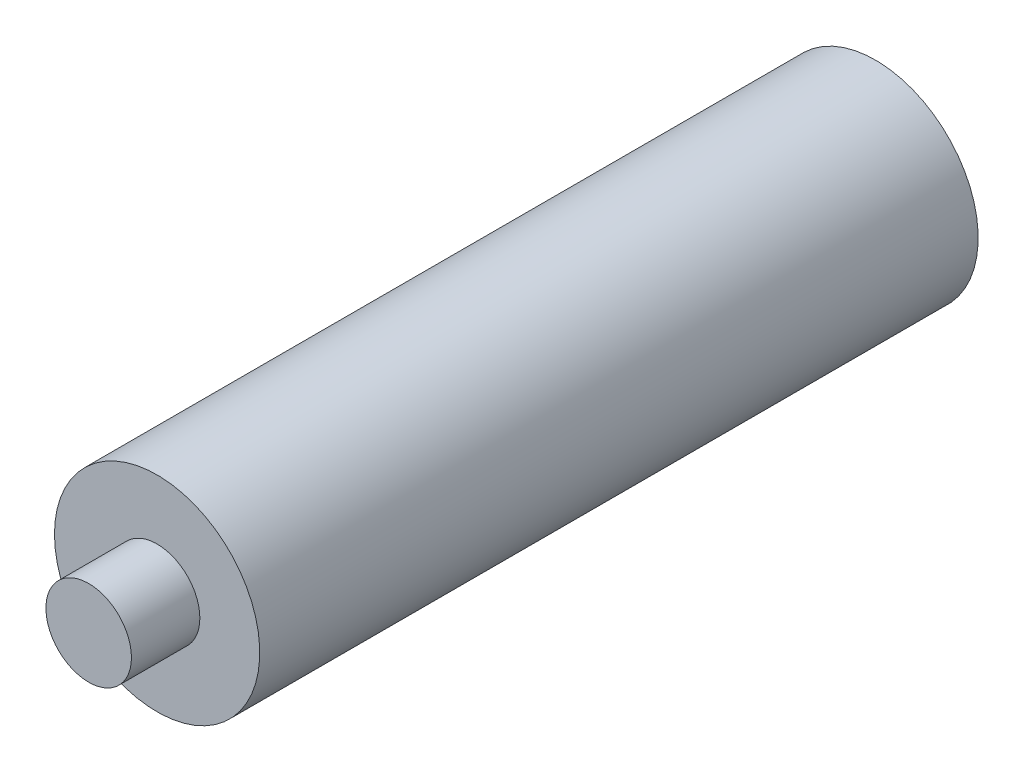
ISO-10303-21;
HEADER;
FILE_DESCRIPTION(('STEP AP214'),'2;1');
FILE_NAME('part.step','',(''),(''),'','','');
FILE_SCHEMA(('AUTOMOTIVE_DESIGN { 1 0 10303 214 1 1 1 1 }'));
ENDSEC;
DATA;
#1=APPLICATION_CONTEXT('core data for automotive mechanical design processes');
#2=APPLICATION_PROTOCOL_DEFINITION('international standard','automotive_design',2000,#1);
#3=PRODUCT_CONTEXT('',#1,'mechanical');
#4=PRODUCT('Part','Part','',(#3));
#5=PRODUCT_RELATED_PRODUCT_CATEGORY('part','',(#4));
#6=PRODUCT_DEFINITION_FORMATION('','',#4);
#7=PRODUCT_DEFINITION_CONTEXT('part definition',#1,'design');
#8=PRODUCT_DEFINITION('design','',#6,#7);
#9=PRODUCT_DEFINITION_SHAPE('','',#8);
#10=(LENGTH_UNIT() NAMED_UNIT(*) SI_UNIT(.MILLI.,.METRE.));
#11=(NAMED_UNIT(*) PLANE_ANGLE_UNIT() SI_UNIT($,.RADIAN.));
#12=(NAMED_UNIT(*) SI_UNIT($,.STERADIAN.) SOLID_ANGLE_UNIT());
#13=UNCERTAINTY_MEASURE_WITH_UNIT(LENGTH_MEASURE(1.E-05),#10,'distance_accuracy_value','');
#14=(GEOMETRIC_REPRESENTATION_CONTEXT(3) GLOBAL_UNCERTAINTY_ASSIGNED_CONTEXT((#13)) GLOBAL_UNIT_ASSIGNED_CONTEXT((#10,
#11,#12)) REPRESENTATION_CONTEXT('',''));
#15=CARTESIAN_POINT('',(0.,0.,0.));
#16=DIRECTION('',(0.,0.,1.));
#17=DIRECTION('',(1.,0.,0.));
#18=AXIS2_PLACEMENT_3D('',#15,#16,#17);
#19=CARTESIAN_POINT('',(0.,0.,21.));
#20=DIRECTION('',(0.,0.,-1.));
#21=DIRECTION('',(-1.,0.,0.));
#22=AXIS2_PLACEMENT_3D('',#19,#20,#21);
#23=CYLINDRICAL_SURFACE('',#22,3.);
#24=CARTESIAN_POINT('',(0.,0.,21.));
#25=DIRECTION('',(0.,0.,1.));
#26=DIRECTION('',(1.,0.,0.));
#27=AXIS2_PLACEMENT_3D('',#24,#25,#26);
#28=CIRCLE('',#27,3.);
#29=CARTESIAN_POINT('',(-3.,0.,21.));
#30=VERTEX_POINT('',#29);
#31=EDGE_CURVE('E41',#30,#30,#28,.T.);
#32=CARTESIAN_POINT('',(0.,0.,0.));
#33=DIRECTION('',(0.,0.,1.));
#34=DIRECTION('',(1.,0.,0.));
#35=AXIS2_PLACEMENT_3D('',#32,#33,#34);
#36=CIRCLE('',#35,3.);
#37=CARTESIAN_POINT('',(-3.,0.,0.));
#38=VERTEX_POINT('',#37);
#39=EDGE_CURVE('E37',#38,#38,#36,.T.);
#40=CARTESIAN_POINT('',(-3.,0.,21.));
#41=CARTESIAN_POINT('',(-3.,0.,20.78125));
#42=CARTESIAN_POINT('',(-3.,0.,20.5625));
#43=CARTESIAN_POINT('',(-3.,0.,20.125));
#44=CARTESIAN_POINT('',(-3.,0.,19.90625));
#45=CARTESIAN_POINT('',(-3.,0.,19.46875));
#46=CARTESIAN_POINT('',(-3.,0.,19.25));
#47=CARTESIAN_POINT('',(-3.,0.,18.8125));
#48=CARTESIAN_POINT('',(-3.,0.,18.59375));
#49=CARTESIAN_POINT('',(-3.,0.,18.15625));
#50=CARTESIAN_POINT('',(-3.,0.,17.9375));
#51=CARTESIAN_POINT('',(-3.,0.,17.5));
#52=CARTESIAN_POINT('',(-3.,0.,17.28125));
#53=CARTESIAN_POINT('',(-3.,0.,16.84375));
#54=CARTESIAN_POINT('',(-3.,0.,16.625));
#55=CARTESIAN_POINT('',(-3.,0.,16.1875));
#56=CARTESIAN_POINT('',(-3.,0.,15.96875));
#57=CARTESIAN_POINT('',(-3.,0.,15.53125));
#58=CARTESIAN_POINT('',(-3.,0.,15.3125));
#59=CARTESIAN_POINT('',(-3.,0.,14.875));
#60=CARTESIAN_POINT('',(-3.,0.,14.65625));
#61=CARTESIAN_POINT('',(-3.,0.,14.21875));
#62=CARTESIAN_POINT('',(-3.,0.,14.));
#63=CARTESIAN_POINT('',(-3.,0.,13.5625));
#64=CARTESIAN_POINT('',(-3.,0.,13.34375));
#65=CARTESIAN_POINT('',(-3.,0.,12.90625));
#66=CARTESIAN_POINT('',(-3.,0.,12.6875));
#67=CARTESIAN_POINT('',(-3.,0.,12.25));
#68=CARTESIAN_POINT('',(-3.,0.,12.03125));
#69=CARTESIAN_POINT('',(-3.,0.,11.59375));
#70=CARTESIAN_POINT('',(-3.,0.,11.375));
#71=CARTESIAN_POINT('',(-3.,0.,10.9375));
#72=CARTESIAN_POINT('',(-3.,0.,10.71875));
#73=CARTESIAN_POINT('',(-3.,0.,10.28125));
#74=CARTESIAN_POINT('',(-3.,0.,10.0625));
#75=CARTESIAN_POINT('',(-3.,0.,9.625));
#76=CARTESIAN_POINT('',(-3.,0.,9.40625));
#77=CARTESIAN_POINT('',(-3.,0.,8.96875));
#78=CARTESIAN_POINT('',(-3.,0.,8.75));
#79=CARTESIAN_POINT('',(-3.,0.,8.3125));
#80=CARTESIAN_POINT('',(-3.,0.,8.09375));
#81=CARTESIAN_POINT('',(-3.,0.,7.65625));
#82=CARTESIAN_POINT('',(-3.,0.,7.4375));
#83=CARTESIAN_POINT('',(-3.,0.,7.));
#84=CARTESIAN_POINT('',(-3.,0.,6.78125));
#85=CARTESIAN_POINT('',(-3.,0.,6.34375));
#86=CARTESIAN_POINT('',(-3.,0.,6.125));
#87=CARTESIAN_POINT('',(-3.,0.,5.6875));
#88=CARTESIAN_POINT('',(-3.,0.,5.46875));
#89=CARTESIAN_POINT('',(-3.,0.,5.03125));
#90=CARTESIAN_POINT('',(-3.,0.,4.8125));
#91=CARTESIAN_POINT('',(-3.,0.,4.375));
#92=CARTESIAN_POINT('',(-3.,0.,4.15625));
#93=CARTESIAN_POINT('',(-3.,0.,3.71875));
#94=CARTESIAN_POINT('',(-3.,0.,3.5));
#95=CARTESIAN_POINT('',(-3.,0.,3.0625));
#96=CARTESIAN_POINT('',(-3.,0.,2.84375));
#97=CARTESIAN_POINT('',(-3.,0.,2.40625));
#98=CARTESIAN_POINT('',(-3.,0.,2.1875));
#99=CARTESIAN_POINT('',(-3.,0.,1.75));
#100=CARTESIAN_POINT('',(-3.,0.,1.53125));
#101=CARTESIAN_POINT('',(-3.,0.,1.09375));
#102=CARTESIAN_POINT('',(-3.,0.,0.875000000000001));
#103=CARTESIAN_POINT('',(-3.,0.,0.4375));
#104=CARTESIAN_POINT('',(-3.,0.,0.21875));
#105=CARTESIAN_POINT('',(-3.,0.,0.));
#106=B_SPLINE_CURVE_WITH_KNOTS('',3,(#40,#41,#42,#43,#44,#45,#46,#47,#48,#49,#50,#51,#52,#53,
#54,#55,#56,#57,#58,#59,#60,#61,#62,#63,#64,#65,#66,#67,#68,#69,#70,#71,#72,#73,#74,#75,#76,#77,
#78,#79,#80,#81,#82,#83,#84,#85,#86,#87,#88,#89,#90,#91,#92,#93,#94,#95,#96,#97,#98,#99,#100,
#101,#102,#103,#104,#105),.UNSPECIFIED.,.F.,.F.,(4,2,2,2,2,2,2,2,2,2,2,2,2,2,2,2,2,2,2,2,2,2,2,
2,2,2,2,2,2,2,2,2,4),(0.,0.656249999999997,1.3125,1.96875,2.625,3.28125,3.9375,4.59375,5.25,
5.90625,6.5625,7.21875,7.875,8.53125,9.1875,9.84375,10.5,11.15625,11.8125,12.46875,13.125,
13.78125,14.4375,15.09375,15.75,16.40625,17.0625,17.71875,18.375,19.03125,19.6875,20.34375,21.),.UNSPECIFIED.);
#107=EDGE_CURVE('BSEAM34',#30,#38,#106,.T.);
#108=ORIENTED_EDGE('',*,*,#31,.F.);
#109=ORIENTED_EDGE('',*,*,#39,.T.);
#110=ORIENTED_EDGE('',*,*,#107,.T.);
#111=ORIENTED_EDGE('',*,*,#107,.F.);
#112=EDGE_LOOP('',(#108,#110,#109,#111));
#113=FACE_BOUND('',#112,.T.);
#114=ADVANCED_FACE('F34',(#113),#23,.T.);
#115=CARTESIAN_POINT('',(0.,0.,21.));
#116=DIRECTION('',(0.,0.,1.));
#117=DIRECTION('',(1.,0.,0.));
#118=AXIS2_PLACEMENT_3D('',#115,#116,#117);
#119=PLANE('',#118);
#120=CARTESIAN_POINT('',(0.,0.,21.));
#121=DIRECTION('',(0.,0.,1.));
#122=DIRECTION('',(1.,0.,0.));
#123=AXIS2_PLACEMENT_3D('',#120,#121,#122);
#124=CIRCLE('',#123,1.25);
#125=CARTESIAN_POINT('',(1.25,0.,21.));
#126=VERTEX_POINT('',#125);
#127=EDGE_CURVE('E10',#126,#126,#124,.T.);
#128=ORIENTED_EDGE('',*,*,#127,.F.);
#129=EDGE_LOOP('',(#128));
#130=FACE_BOUND('',#129,.T.);
#131=ORIENTED_EDGE('',*,*,#31,.T.);
#132=EDGE_LOOP('',(#131));
#133=FACE_BOUND('',#132,.T.);
#134=ADVANCED_FACE('F58',(#130,#133),#119,.T.);
#135=CARTESIAN_POINT('',(0.,0.,0.));
#136=DIRECTION('',(0.,0.,1.));
#137=DIRECTION('',(1.,0.,0.));
#138=AXIS2_PLACEMENT_3D('',#135,#136,#137);
#139=PLANE('',#138);
#140=ORIENTED_EDGE('',*,*,#39,.F.);
#141=EDGE_LOOP('',(#140));
#142=FACE_BOUND('',#141,.T.);
#143=ADVANCED_FACE('F55',(#142),#139,.F.);
#144=CARTESIAN_POINT('',(0.,0.,23.));
#145=DIRECTION('',(0.,0.,-1.));
#146=DIRECTION('',(-1.,0.,0.));
#147=AXIS2_PLACEMENT_3D('',#144,#145,#146);
#148=CYLINDRICAL_SURFACE('',#147,1.25);
#149=CARTESIAN_POINT('',(0.,0.,23.));
#150=DIRECTION('',(0.,0.,1.));
#151=DIRECTION('',(1.,0.,0.));
#152=AXIS2_PLACEMENT_3D('',#149,#150,#151);
#153=CIRCLE('',#152,1.25);
#154=CARTESIAN_POINT('',(1.25,0.,23.));
#155=VERTEX_POINT('',#154);
#156=EDGE_CURVE('E47',#155,#155,#153,.T.);
#157=ORIENTED_EDGE('',*,*,#156,.F.);
#158=EDGE_LOOP('',(#157));
#159=FACE_BOUND('',#158,.T.);
#160=ORIENTED_EDGE('',*,*,#127,.T.);
#161=EDGE_LOOP('',(#160));
#162=FACE_BOUND('',#161,.T.);
#163=ADVANCED_FACE('F57',(#159,#162),#148,.T.);
#164=CARTESIAN_POINT('',(0.,0.,23.));
#165=DIRECTION('',(0.,0.,1.));
#166=DIRECTION('',(1.,0.,0.));
#167=AXIS2_PLACEMENT_3D('',#164,#165,#166);
#168=PLANE('',#167);
#169=ORIENTED_EDGE('',*,*,#156,.T.);
#170=EDGE_LOOP('',(#169));
#171=FACE_BOUND('',#170,.T.);
#172=ADVANCED_FACE('F63',(#171),#168,.T.);
#173=CLOSED_SHELL('',(#114,#134,#143,#163,#172));
#174=MANIFOLD_SOLID_BREP('B2',#173);
#175=ADVANCED_BREP_SHAPE_REPRESENTATION('',(#18,#174),#14);
#176=SHAPE_DEFINITION_REPRESENTATION(#9,#175);
ENDSEC;
END-ISO-10303-21;
